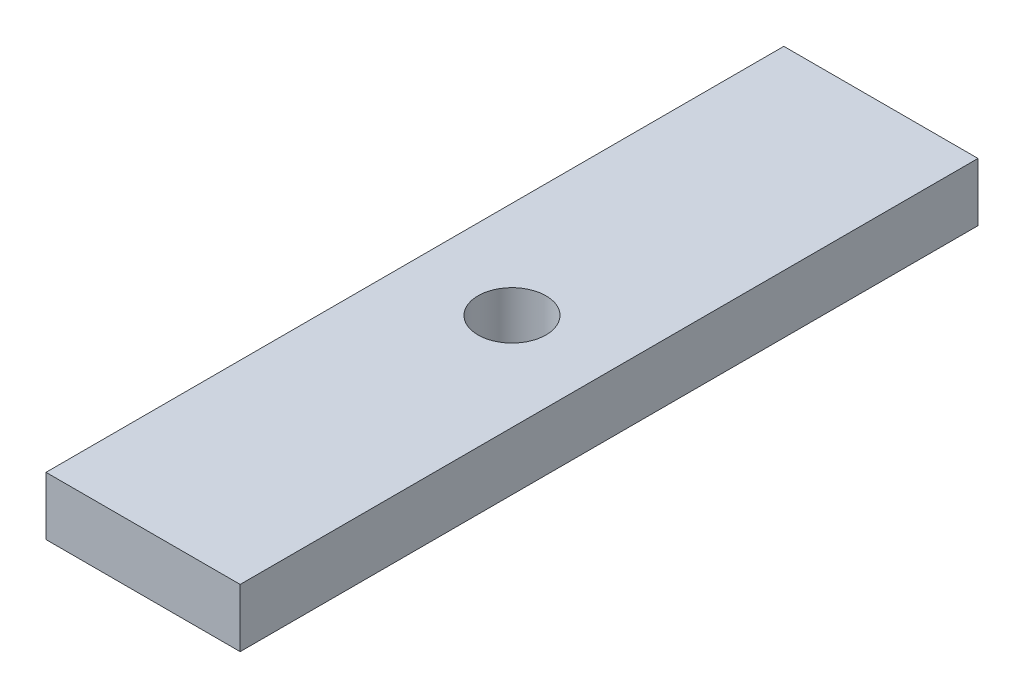
ISO-10303-21;
HEADER;
FILE_DESCRIPTION(('STEP AP214'),'2;1');
FILE_NAME('part.step','',(''),(''),'','','');
FILE_SCHEMA(('AUTOMOTIVE_DESIGN { 1 0 10303 214 1 1 1 1 }'));
ENDSEC;
DATA;
#1=APPLICATION_CONTEXT('core data for automotive mechanical design processes');
#2=APPLICATION_PROTOCOL_DEFINITION('international standard','automotive_design',2000,#1);
#3=PRODUCT_CONTEXT('',#1,'mechanical');
#4=PRODUCT('Part','Part','',(#3));
#5=PRODUCT_RELATED_PRODUCT_CATEGORY('part','',(#4));
#6=PRODUCT_DEFINITION_FORMATION('','',#4);
#7=PRODUCT_DEFINITION_CONTEXT('part definition',#1,'design');
#8=PRODUCT_DEFINITION('design','',#6,#7);
#9=PRODUCT_DEFINITION_SHAPE('','',#8);
#10=(LENGTH_UNIT() NAMED_UNIT(*) SI_UNIT(.MILLI.,.METRE.));
#11=(NAMED_UNIT(*) PLANE_ANGLE_UNIT() SI_UNIT($,.RADIAN.));
#12=(NAMED_UNIT(*) SI_UNIT($,.STERADIAN.) SOLID_ANGLE_UNIT());
#13=UNCERTAINTY_MEASURE_WITH_UNIT(LENGTH_MEASURE(1.E-05),#10,'distance_accuracy_value','');
#14=(GEOMETRIC_REPRESENTATION_CONTEXT(3) GLOBAL_UNCERTAINTY_ASSIGNED_CONTEXT((#13)) GLOBAL_UNIT_ASSIGNED_CONTEXT((#10,
#11,#12)) REPRESENTATION_CONTEXT('',''));
#15=CARTESIAN_POINT('',(0.,0.,0.));
#16=DIRECTION('',(0.,0.,1.));
#17=DIRECTION('',(1.,0.,0.));
#18=AXIS2_PLACEMENT_3D('',#15,#16,#17);
#19=CARTESIAN_POINT('',(10.,0.,0.));
#20=DIRECTION('',(0.,0.,1.));
#21=DIRECTION('',(1.,0.,0.));
#22=AXIS2_PLACEMENT_3D('',#19,#20,#21);
#23=PLANE('',#22);
#24=DIRECTION('',(0.,1.,0.));
#25=VECTOR('',#24,1.);
#26=CARTESIAN_POINT('',(0.,0.,0.));
#27=LINE('',#26,#25);
#28=CARTESIAN_POINT('',(0.,0.,0.));
#29=VERTEX_POINT('',#28);
#30=CARTESIAN_POINT('',(0.,3.,0.));
#31=VERTEX_POINT('',#30);
#32=EDGE_CURVE('E97',#29,#31,#27,.T.);
#33=ORIENTED_EDGE('',*,*,#32,.T.);
#34=DIRECTION('',(-1.,0.,0.));
#35=VECTOR('',#34,1.);
#36=CARTESIAN_POINT('',(10.,3.,0.));
#37=LINE('',#36,#35);
#38=CARTESIAN_POINT('',(10.,3.,0.));
#39=VERTEX_POINT('',#38);
#40=EDGE_CURVE('E11',#39,#31,#37,.T.);
#41=ORIENTED_EDGE('',*,*,#40,.F.);
#42=DIRECTION('',(0.,1.,0.));
#43=VECTOR('',#42,1.);
#44=CARTESIAN_POINT('',(10.,0.,0.));
#45=LINE('',#44,#43);
#46=CARTESIAN_POINT('',(10.,0.,0.));
#47=VERTEX_POINT('',#46);
#48=EDGE_CURVE('E84',#47,#39,#45,.T.);
#49=ORIENTED_EDGE('',*,*,#48,.F.);
#50=DIRECTION('',(-1.,0.,0.));
#51=VECTOR('',#50,1.);
#52=CARTESIAN_POINT('',(10.,0.,0.));
#53=LINE('',#52,#51);
#54=EDGE_CURVE('E93',#47,#29,#53,.T.);
#55=ORIENTED_EDGE('',*,*,#54,.T.);
#56=EDGE_LOOP('',(#33,#41,#49,#55));
#57=FACE_BOUND('',#56,.T.);
#58=ADVANCED_FACE('F32',(#57),#23,.F.);
#59=CARTESIAN_POINT('',(10.,3.,0.));
#60=DIRECTION('',(0.,-1.,0.));
#61=DIRECTION('',(0.,0.,-1.));
#62=AXIS2_PLACEMENT_3D('',#59,#60,#61);
#63=PLANE('',#62);
#64=CARTESIAN_POINT('',(5.,3.,19.));
#65=DIRECTION('',(0.,1.,0.));
#66=DIRECTION('',(0.,0.,1.));
#67=AXIS2_PLACEMENT_3D('',#64,#65,#66);
#68=CIRCLE('',#67,1.75);
#69=CARTESIAN_POINT('',(5.,3.,20.75));
#70=VERTEX_POINT('',#69);
#71=EDGE_CURVE('E110',#70,#70,#68,.T.);
#72=ORIENTED_EDGE('',*,*,#71,.F.);
#73=EDGE_LOOP('',(#72));
#74=FACE_BOUND('',#73,.T.);
#75=DIRECTION('',(0.,0.,1.));
#76=VECTOR('',#75,1.);
#77=CARTESIAN_POINT('',(0.,3.,0.));
#78=LINE('',#77,#76);
#79=CARTESIAN_POINT('',(0.,3.,38.));
#80=VERTEX_POINT('',#79);
#81=EDGE_CURVE('E88',#31,#80,#78,.T.);
#82=ORIENTED_EDGE('',*,*,#81,.T.);
#83=DIRECTION('',(-1.,0.,0.));
#84=VECTOR('',#83,1.);
#85=CARTESIAN_POINT('',(10.,3.,38.));
#86=LINE('',#85,#84);
#87=CARTESIAN_POINT('',(10.,3.,38.));
#88=VERTEX_POINT('',#87);
#89=EDGE_CURVE('E41',#88,#80,#86,.T.);
#90=ORIENTED_EDGE('',*,*,#89,.F.);
#91=DIRECTION('',(0.,0.,1.));
#92=VECTOR('',#91,1.);
#93=CARTESIAN_POINT('',(10.,3.,0.));
#94=LINE('',#93,#92);
#95=EDGE_CURVE('E79',#39,#88,#94,.T.);
#96=ORIENTED_EDGE('',*,*,#95,.F.);
#97=ORIENTED_EDGE('',*,*,#40,.T.);
#98=EDGE_LOOP('',(#82,#90,#96,#97));
#99=FACE_BOUND('',#98,.T.);
#100=ADVANCED_FACE('F87',(#74,#99),#63,.F.);
#101=CARTESIAN_POINT('',(10.,0.,38.));
#102=DIRECTION('',(0.,0.,-1.));
#103=DIRECTION('',(-1.,0.,0.));
#104=AXIS2_PLACEMENT_3D('',#101,#102,#103);
#105=PLANE('',#104);
#106=DIRECTION('',(0.,-1.,0.));
#107=VECTOR('',#106,1.);
#108=CARTESIAN_POINT('',(0.,0.,38.));
#109=LINE('',#108,#107);
#110=CARTESIAN_POINT('',(0.,0.,38.));
#111=VERTEX_POINT('',#110);
#112=EDGE_CURVE('E66',#80,#111,#109,.T.);
#113=ORIENTED_EDGE('',*,*,#112,.T.);
#114=DIRECTION('',(-1.,0.,0.));
#115=VECTOR('',#114,1.);
#116=CARTESIAN_POINT('',(10.,0.,38.));
#117=LINE('',#116,#115);
#118=CARTESIAN_POINT('',(10.,0.,38.));
#119=VERTEX_POINT('',#118);
#120=EDGE_CURVE('E89',#119,#111,#117,.T.);
#121=ORIENTED_EDGE('',*,*,#120,.F.);
#122=DIRECTION('',(0.,-1.,0.));
#123=VECTOR('',#122,1.);
#124=CARTESIAN_POINT('',(10.,0.,38.));
#125=LINE('',#124,#123);
#126=EDGE_CURVE('E82',#88,#119,#125,.T.);
#127=ORIENTED_EDGE('',*,*,#126,.F.);
#128=ORIENTED_EDGE('',*,*,#89,.T.);
#129=EDGE_LOOP('',(#113,#121,#127,#128));
#130=FACE_BOUND('',#129,.T.);
#131=ADVANCED_FACE('F91',(#130),#105,.F.);
#132=CARTESIAN_POINT('',(10.,0.,0.));
#133=DIRECTION('',(0.,1.,0.));
#134=DIRECTION('',(0.,0.,1.));
#135=AXIS2_PLACEMENT_3D('',#132,#133,#134);
#136=PLANE('',#135);
#137=CARTESIAN_POINT('',(5.,0.,19.));
#138=DIRECTION('',(0.,1.,0.));
#139=DIRECTION('',(0.,0.,1.));
#140=AXIS2_PLACEMENT_3D('',#137,#138,#139);
#141=CIRCLE('',#140,1.75);
#142=CARTESIAN_POINT('',(5.,0.,20.75));
#143=VERTEX_POINT('',#142);
#144=EDGE_CURVE('E35',#143,#143,#141,.T.);
#145=ORIENTED_EDGE('',*,*,#144,.T.);
#146=EDGE_LOOP('',(#145));
#147=FACE_BOUND('',#146,.T.);
#148=DIRECTION('',(0.,0.,-1.));
#149=VECTOR('',#148,1.);
#150=CARTESIAN_POINT('',(0.,0.,0.));
#151=LINE('',#150,#149);
#152=EDGE_CURVE('E72',#111,#29,#151,.T.);
#153=ORIENTED_EDGE('',*,*,#152,.T.);
#154=ORIENTED_EDGE('',*,*,#54,.F.);
#155=DIRECTION('',(0.,0.,-1.));
#156=VECTOR('',#155,1.);
#157=CARTESIAN_POINT('',(10.,0.,0.));
#158=LINE('',#157,#156);
#159=EDGE_CURVE('E49',#119,#47,#158,.T.);
#160=ORIENTED_EDGE('',*,*,#159,.F.);
#161=ORIENTED_EDGE('',*,*,#120,.T.);
#162=EDGE_LOOP('',(#153,#154,#160,#161));
#163=FACE_BOUND('',#162,.T.);
#164=ADVANCED_FACE('F104',(#147,#163),#136,.F.);
#165=CARTESIAN_POINT('',(10.,0.,0.));
#166=DIRECTION('',(1.,0.,0.));
#167=DIRECTION('',(0.,0.,-1.));
#168=AXIS2_PLACEMENT_3D('',#165,#166,#167);
#169=PLANE('',#168);
#170=ORIENTED_EDGE('',*,*,#48,.T.);
#171=ORIENTED_EDGE('',*,*,#95,.T.);
#172=ORIENTED_EDGE('',*,*,#126,.T.);
#173=ORIENTED_EDGE('',*,*,#159,.T.);
#174=EDGE_LOOP('',(#170,#171,#172,#173));
#175=FACE_BOUND('',#174,.T.);
#176=ADVANCED_FACE('F80',(#175),#169,.T.);
#177=CARTESIAN_POINT('',(0.,0.,0.));
#178=DIRECTION('',(1.,0.,0.));
#179=DIRECTION('',(0.,0.,-1.));
#180=AXIS2_PLACEMENT_3D('',#177,#178,#179);
#181=PLANE('',#180);
#182=ORIENTED_EDGE('',*,*,#32,.F.);
#183=ORIENTED_EDGE('',*,*,#152,.F.);
#184=ORIENTED_EDGE('',*,*,#112,.F.);
#185=ORIENTED_EDGE('',*,*,#81,.F.);
#186=EDGE_LOOP('',(#182,#183,#184,#185));
#187=FACE_BOUND('',#186,.T.);
#188=ADVANCED_FACE('F107',(#187),#181,.F.);
#189=CARTESIAN_POINT('',(5.,-7.,19.));
#190=DIRECTION('',(0.,1.,0.));
#191=DIRECTION('',(0.,0.,1.));
#192=AXIS2_PLACEMENT_3D('',#189,#190,#191);
#193=CYLINDRICAL_SURFACE('',#192,1.75);
#194=ORIENTED_EDGE('',*,*,#71,.T.);
#195=EDGE_LOOP('',(#194));
#196=FACE_BOUND('',#195,.T.);
#197=ORIENTED_EDGE('',*,*,#144,.F.);
#198=EDGE_LOOP('',(#197));
#199=FACE_BOUND('',#198,.T.);
#200=ADVANCED_FACE('F118',(#196,#199),#193,.F.);
#201=CLOSED_SHELL('',(#58,#100,#131,#164,#176,#188,#200));
#202=MANIFOLD_SOLID_BREP('B2',#201);
#203=ADVANCED_BREP_SHAPE_REPRESENTATION('',(#18,#202),#14);
#204=SHAPE_DEFINITION_REPRESENTATION(#9,#203);
ENDSEC;
END-ISO-10303-21;
